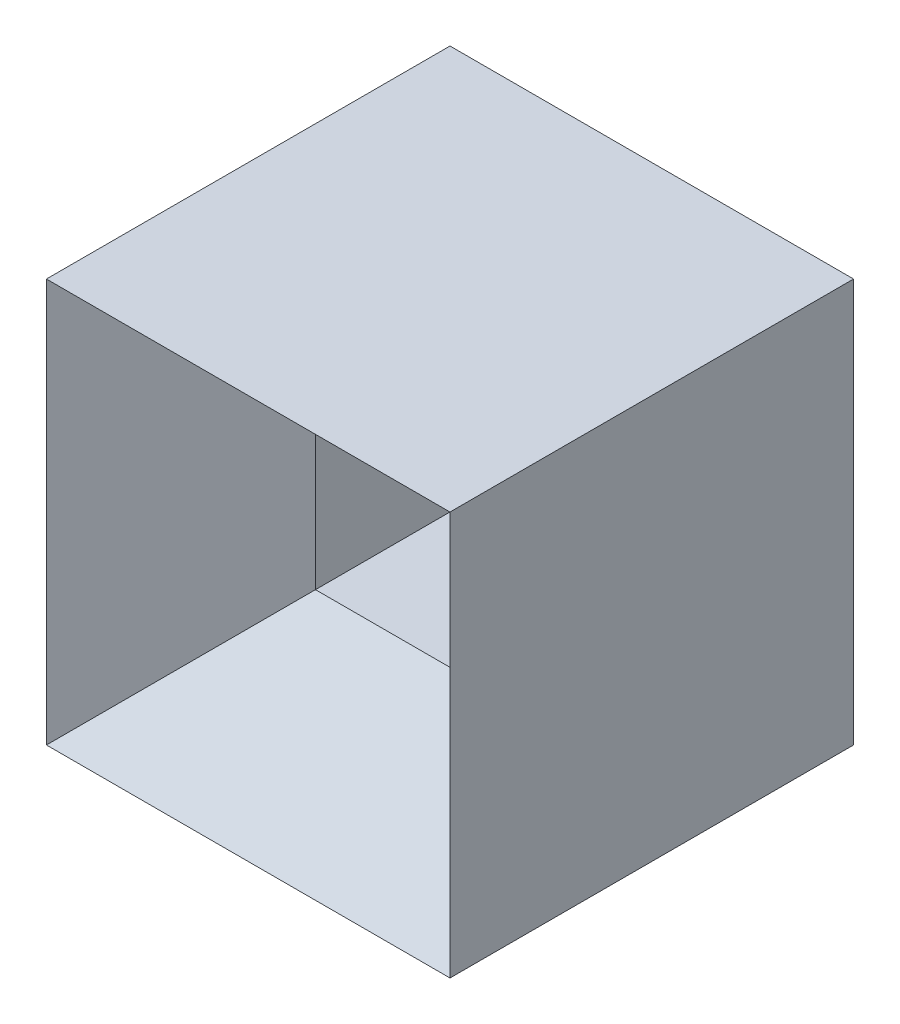
ISO-10303-21;
HEADER;
FILE_DESCRIPTION(('STEP AP214'),'2;1');
FILE_NAME('part.step','',(''),(''),'','','');
FILE_SCHEMA(('AUTOMOTIVE_DESIGN { 1 0 10303 214 1 1 1 1 }'));
ENDSEC;
DATA;
#1=APPLICATION_CONTEXT('core data for automotive mechanical design processes');
#2=APPLICATION_PROTOCOL_DEFINITION('international standard','automotive_design',2000,#1);
#3=PRODUCT_CONTEXT('',#1,'mechanical');
#4=PRODUCT('Part','Part','',(#3));
#5=PRODUCT_RELATED_PRODUCT_CATEGORY('part','',(#4));
#6=PRODUCT_DEFINITION_FORMATION('','',#4);
#7=PRODUCT_DEFINITION_CONTEXT('part definition',#1,'design');
#8=PRODUCT_DEFINITION('design','',#6,#7);
#9=PRODUCT_DEFINITION_SHAPE('','',#8);
#10=(LENGTH_UNIT() NAMED_UNIT(*) SI_UNIT(.MILLI.,.METRE.));
#11=(NAMED_UNIT(*) PLANE_ANGLE_UNIT() SI_UNIT($,.RADIAN.));
#12=(NAMED_UNIT(*) SI_UNIT($,.STERADIAN.) SOLID_ANGLE_UNIT());
#13=UNCERTAINTY_MEASURE_WITH_UNIT(LENGTH_MEASURE(1.E-05),#10,'distance_accuracy_value','');
#14=(GEOMETRIC_REPRESENTATION_CONTEXT(3) GLOBAL_UNCERTAINTY_ASSIGNED_CONTEXT((#13)) GLOBAL_UNIT_ASSIGNED_CONTEXT((#10,
#11,#12)) REPRESENTATION_CONTEXT('',''));
#15=CARTESIAN_POINT('',(0.,0.,0.));
#16=DIRECTION('',(0.,0.,1.));
#17=DIRECTION('',(1.,0.,0.));
#18=AXIS2_PLACEMENT_3D('',#15,#16,#17);
#19=CARTESIAN_POINT('',(0.,0.,0.));
#20=DIRECTION('',(0.,1.,0.));
#21=DIRECTION('',(0.,0.,1.));
#22=AXIS2_PLACEMENT_3D('',#19,#20,#21);
#23=PLANE('',#22);
#24=DIRECTION('',(0.,0.,1.));
#25=VECTOR('',#24,1.);
#26=CARTESIAN_POINT('',(-15.,0.,15.));
#27=LINE('',#26,#25);
#28=CARTESIAN_POINT('',(-14.9999999999998,-1.52655665885959E-13,-15.));
#29=VERTEX_POINT('',#28);
#30=CARTESIAN_POINT('',(-14.9999999999998,-1.59594559789866E-13,15.));
#31=VERTEX_POINT('',#30);
#32=EDGE_CURVE('E514',#29,#31,#27,.T.);
#33=ORIENTED_EDGE('',*,*,#32,.F.);
#34=DIRECTION('',(-1.,0.,0.));
#35=VECTOR('',#34,1.);
#36=CARTESIAN_POINT('',(15.,0.,-15.));
#37=LINE('',#36,#35);
#38=CARTESIAN_POINT('',(15.0000000000001,0.,-15.));
#39=VERTEX_POINT('',#38);
#40=EDGE_CURVE('E191',#39,#29,#37,.T.);
#41=ORIENTED_EDGE('',*,*,#40,.F.);
#42=DIRECTION('',(0.,0.,-1.));
#43=VECTOR('',#42,1.);
#44=CARTESIAN_POINT('',(15.,0.,15.));
#45=LINE('',#44,#43);
#46=CARTESIAN_POINT('',(15.,0.,15.));
#47=VERTEX_POINT('',#46);
#48=EDGE_CURVE('E89',#47,#39,#45,.T.);
#49=ORIENTED_EDGE('',*,*,#48,.F.);
#50=DIRECTION('',(1.,0.,0.));
#51=VECTOR('',#50,1.);
#52=CARTESIAN_POINT('',(15.,0.,15.));
#53=LINE('',#52,#51);
#54=EDGE_CURVE('E12',#31,#47,#53,.T.);
#55=ORIENTED_EDGE('',*,*,#54,.F.);
#56=EDGE_LOOP('',(#33,#41,#49,#55));
#57=FACE_BOUND('',#56,.T.);
#58=ADVANCED_FACE('F79',(#57),#23,.F.);
#59=CARTESIAN_POINT('',(0.,10.,0.));
#60=DIRECTION('',(0.,1.,0.));
#61=DIRECTION('',(0.,0.,1.));
#62=AXIS2_PLACEMENT_3D('',#59,#60,#61);
#63=PLANE('',#62);
#64=DIRECTION('',(0.,0.,1.));
#65=VECTOR('',#64,1.);
#66=CARTESIAN_POINT('',(-5.,10.,5.));
#67=LINE('',#66,#65);
#68=CARTESIAN_POINT('',(-4.99999999999995,9.99999999999995,-5.));
#69=VERTEX_POINT('',#68);
#70=CARTESIAN_POINT('',(-5.,10.,5.));
#71=VERTEX_POINT('',#70);
#72=EDGE_CURVE('E147',#69,#71,#67,.T.);
#73=ORIENTED_EDGE('',*,*,#72,.T.);
#74=DIRECTION('',(1.,0.,0.));
#75=VECTOR('',#74,1.);
#76=CARTESIAN_POINT('',(5.,10.,5.));
#77=LINE('',#76,#75);
#78=CARTESIAN_POINT('',(5.00000000000002,10.,5.));
#79=VERTEX_POINT('',#78);
#80=EDGE_CURVE('E195',#71,#79,#77,.T.);
#81=ORIENTED_EDGE('',*,*,#80,.T.);
#82=DIRECTION('',(0.,0.,-1.));
#83=VECTOR('',#82,1.);
#84=CARTESIAN_POINT('',(5.,10.,5.));
#85=LINE('',#84,#83);
#86=CARTESIAN_POINT('',(5.,10.,-5.));
#87=VERTEX_POINT('',#86);
#88=EDGE_CURVE('E181',#79,#87,#85,.T.);
#89=ORIENTED_EDGE('',*,*,#88,.T.);
#90=DIRECTION('',(-1.,0.,0.));
#91=VECTOR('',#90,1.);
#92=CARTESIAN_POINT('',(5.,10.,-5.));
#93=LINE('',#92,#91);
#94=EDGE_CURVE('E161',#87,#69,#93,.T.);
#95=ORIENTED_EDGE('',*,*,#94,.T.);
#96=EDGE_LOOP('',(#73,#81,#89,#95));
#97=FACE_BOUND('',#96,.T.);
#98=ADVANCED_FACE('F179',(#97),#63,.T.);
#99=CARTESIAN_POINT('',(0.,7.5,7.5));
#100=DIRECTION('',(0.,0.707106781186548,0.707106781186548));
#101=DIRECTION('',(0.,-0.707106781186548,0.707106781186548));
#102=AXIS2_PLACEMENT_3D('',#99,#100,#101);
#103=PLANE('',#102);
#104=DIRECTION('',(-0.577350269189626,-0.577350269189626,0.577350269189626));
#105=VECTOR('',#104,1.);
#106=CARTESIAN_POINT('',(-5.,10.,5.));
#107=LINE('',#106,#105);
#108=EDGE_CURVE('E96',#71,#31,#107,.T.);
#109=ORIENTED_EDGE('',*,*,#108,.T.);
#110=ORIENTED_EDGE('',*,*,#54,.T.);
#111=DIRECTION('',(0.577350269189626,-0.577350269189626,0.577350269189626));
#112=VECTOR('',#111,1.);
#113=CARTESIAN_POINT('',(5.,10.,5.));
#114=LINE('',#113,#112);
#115=EDGE_CURVE('E512',#79,#47,#114,.T.);
#116=ORIENTED_EDGE('',*,*,#115,.F.);
#117=ORIENTED_EDGE('',*,*,#80,.F.);
#118=EDGE_LOOP('',(#109,#110,#116,#117));
#119=FACE_BOUND('',#118,.T.);
#120=ADVANCED_FACE('F220',(#119),#103,.T.);
#121=CARTESIAN_POINT('',(0.,7.5,-7.5));
#122=DIRECTION('',(0.,0.707106781186547,-0.707106781186548));
#123=DIRECTION('',(0.,0.707106781186548,0.707106781186547));
#124=AXIS2_PLACEMENT_3D('',#121,#122,#123);
#125=PLANE('',#124);
#126=DIRECTION('',(0.577350269189626,-0.577350269189626,-0.577350269189626));
#127=VECTOR('',#126,1.);
#128=CARTESIAN_POINT('',(5.,10.,-5.));
#129=LINE('',#128,#127);
#130=EDGE_CURVE('E104',#87,#39,#129,.T.);
#131=ORIENTED_EDGE('',*,*,#130,.T.);
#132=ORIENTED_EDGE('',*,*,#40,.T.);
#133=DIRECTION('',(-0.577350269189626,-0.577350269189626,-0.577350269189626));
#134=VECTOR('',#133,1.);
#135=CARTESIAN_POINT('',(-5.,10.,-5.));
#136=LINE('',#135,#134);
#137=EDGE_CURVE('E168',#69,#29,#136,.T.);
#138=ORIENTED_EDGE('',*,*,#137,.F.);
#139=ORIENTED_EDGE('',*,*,#94,.F.);
#140=EDGE_LOOP('',(#131,#132,#138,#139));
#141=FACE_BOUND('',#140,.T.);
#142=ADVANCED_FACE('F189',(#141),#125,.T.);
#143=CARTESIAN_POINT('',(15.,15.0000000000001,0.));
#144=DIRECTION('',(-1.,0.,0.));
#145=DIRECTION('',(0.,0.,1.));
#146=AXIS2_PLACEMENT_3D('',#143,#144,#145);
#147=PLANE('',#146);
#148=ORIENTED_EDGE('',*,*,#48,.T.);
#149=DIRECTION('',(0.,-1.,0.));
#150=VECTOR('',#149,1.);
#151=CARTESIAN_POINT('',(15.,30.0000000000001,-15.));
#152=LINE('',#151,#150);
#153=CARTESIAN_POINT('',(15.,30.,-15.));
#154=VERTEX_POINT('',#153);
#155=EDGE_CURVE('E385',#154,#39,#152,.T.);
#156=ORIENTED_EDGE('',*,*,#155,.F.);
#157=DIRECTION('',(0.,0.,-1.));
#158=VECTOR('',#157,1.);
#159=CARTESIAN_POINT('',(14.9999999999999,30.,15.));
#160=LINE('',#159,#158);
#161=CARTESIAN_POINT('',(15.,30.,15.));
#162=VERTEX_POINT('',#161);
#163=EDGE_CURVE('E381',#162,#154,#160,.T.);
#164=ORIENTED_EDGE('',*,*,#163,.F.);
#165=DIRECTION('',(0.,1.,0.));
#166=VECTOR('',#165,1.);
#167=CARTESIAN_POINT('',(14.9999999999999,30.,15.));
#168=LINE('',#167,#166);
#169=EDGE_CURVE('E162',#47,#162,#168,.T.);
#170=ORIENTED_EDGE('',*,*,#169,.F.);
#171=EDGE_LOOP('',(#148,#156,#164,#170));
#172=FACE_BOUND('',#171,.T.);
#173=ADVANCED_FACE('F219',(#172),#147,.F.);
#174=CARTESIAN_POINT('',(5.,15.,0.));
#175=DIRECTION('',(-1.,0.,0.));
#176=DIRECTION('',(0.,0.,1.));
#177=AXIS2_PLACEMENT_3D('',#174,#175,#176);
#178=PLANE('',#177);
#179=ORIENTED_EDGE('',*,*,#88,.F.);
#180=DIRECTION('',(0.,1.,0.));
#181=VECTOR('',#180,1.);
#182=CARTESIAN_POINT('',(4.99999999999998,20.,5.));
#183=LINE('',#182,#181);
#184=CARTESIAN_POINT('',(5.,20.,5.));
#185=VERTEX_POINT('',#184);
#186=EDGE_CURVE('E465',#79,#185,#183,.T.);
#187=ORIENTED_EDGE('',*,*,#186,.T.);
#188=DIRECTION('',(0.,0.,-1.));
#189=VECTOR('',#188,1.);
#190=CARTESIAN_POINT('',(4.99999999999998,20.,5.));
#191=LINE('',#190,#189);
#192=CARTESIAN_POINT('',(4.99999999999998,20.,-5.));
#193=VERTEX_POINT('',#192);
#194=EDGE_CURVE('E461',#185,#193,#191,.T.);
#195=ORIENTED_EDGE('',*,*,#194,.T.);
#196=DIRECTION('',(0.,-1.,0.));
#197=VECTOR('',#196,1.);
#198=CARTESIAN_POINT('',(4.99999999999998,20.,-5.));
#199=LINE('',#198,#197);
#200=EDGE_CURVE('E311',#193,#87,#199,.T.);
#201=ORIENTED_EDGE('',*,*,#200,.T.);
#202=EDGE_LOOP('',(#179,#187,#195,#201));
#203=FACE_BOUND('',#202,.T.);
#204=ADVANCED_FACE('F348',(#203),#178,.T.);
#205=CARTESIAN_POINT('',(7.5,15.,7.5));
#206=DIRECTION('',(-0.707106781186548,0.,0.707106781186547));
#207=DIRECTION('',(0.707106781186547,0.,0.707106781186548));
#208=AXIS2_PLACEMENT_3D('',#205,#206,#207);
#209=PLANE('',#208);
#210=ORIENTED_EDGE('',*,*,#115,.T.);
#211=ORIENTED_EDGE('',*,*,#169,.T.);
#212=DIRECTION('',(0.577350269189624,0.577350269189628,0.577350269189626));
#213=VECTOR('',#212,1.);
#214=CARTESIAN_POINT('',(4.99999999999998,20.,5.));
#215=LINE('',#214,#213);
#216=EDGE_CURVE('E391',#185,#162,#215,.T.);
#217=ORIENTED_EDGE('',*,*,#216,.F.);
#218=ORIENTED_EDGE('',*,*,#186,.F.);
#219=EDGE_LOOP('',(#210,#211,#217,#218));
#220=FACE_BOUND('',#219,.T.);
#221=ADVANCED_FACE('F353',(#220),#209,.T.);
#222=CARTESIAN_POINT('',(7.5,15.,-7.5));
#223=DIRECTION('',(-0.707106781186547,0.,-0.707106781186548));
#224=DIRECTION('',(-0.707106781186548,0.,0.707106781186547));
#225=AXIS2_PLACEMENT_3D('',#222,#223,#224);
#226=PLANE('',#225);
#227=DIRECTION('',(0.577350269189624,0.577350269189628,-0.577350269189626));
#228=VECTOR('',#227,1.);
#229=CARTESIAN_POINT('',(4.99999999999998,20.,-5.));
#230=LINE('',#229,#228);
#231=EDGE_CURVE('E470',#193,#154,#230,.T.);
#232=ORIENTED_EDGE('',*,*,#231,.T.);
#233=ORIENTED_EDGE('',*,*,#155,.T.);
#234=ORIENTED_EDGE('',*,*,#130,.F.);
#235=ORIENTED_EDGE('',*,*,#200,.F.);
#236=EDGE_LOOP('',(#232,#233,#234,#235));
#237=FACE_BOUND('',#236,.T.);
#238=ADVANCED_FACE('F346',(#237),#226,.T.);
#239=CARTESIAN_POINT('',(0.,30.,0.));
#240=DIRECTION('',(0.,-1.,0.));
#241=DIRECTION('',(0.,0.,1.));
#242=AXIS2_PLACEMENT_3D('',#239,#240,#241);
#243=PLANE('',#242);
#244=ORIENTED_EDGE('',*,*,#163,.T.);
#245=DIRECTION('',(1.,0.,0.));
#246=VECTOR('',#245,1.);
#247=CARTESIAN_POINT('',(-15.,30.,-15.));
#248=LINE('',#247,#246);
#249=CARTESIAN_POINT('',(-15.0000000000002,29.9999999999998,-15.));
#250=VERTEX_POINT('',#249);
#251=EDGE_CURVE('E317',#250,#154,#248,.T.);
#252=ORIENTED_EDGE('',*,*,#251,.F.);
#253=DIRECTION('',(0.,0.,-1.));
#254=VECTOR('',#253,1.);
#255=CARTESIAN_POINT('',(-15.,30.,15.));
#256=LINE('',#255,#254);
#257=CARTESIAN_POINT('',(-15.0000000000002,29.9999999999998,15.));
#258=VERTEX_POINT('',#257);
#259=EDGE_CURVE('E312',#258,#250,#256,.T.);
#260=ORIENTED_EDGE('',*,*,#259,.F.);
#261=DIRECTION('',(-1.,0.,0.));
#262=VECTOR('',#261,1.);
#263=CARTESIAN_POINT('',(-15.,30.,15.));
#264=LINE('',#263,#262);
#265=EDGE_CURVE('E306',#162,#258,#264,.T.);
#266=ORIENTED_EDGE('',*,*,#265,.F.);
#267=EDGE_LOOP('',(#244,#252,#260,#266));
#268=FACE_BOUND('',#267,.T.);
#269=ADVANCED_FACE('F281',(#268),#243,.F.);
#270=CARTESIAN_POINT('',(0.,20.,0.));
#271=DIRECTION('',(0.,-1.,0.));
#272=DIRECTION('',(0.,0.,1.));
#273=AXIS2_PLACEMENT_3D('',#270,#271,#272);
#274=PLANE('',#273);
#275=ORIENTED_EDGE('',*,*,#194,.F.);
#276=DIRECTION('',(-1.,0.,0.));
#277=VECTOR('',#276,1.);
#278=CARTESIAN_POINT('',(-5.,20.,5.));
#279=LINE('',#278,#277);
#280=CARTESIAN_POINT('',(-5.00000000000005,19.9999999999999,5.));
#281=VERTEX_POINT('',#280);
#282=EDGE_CURVE('E568',#185,#281,#279,.T.);
#283=ORIENTED_EDGE('',*,*,#282,.T.);
#284=DIRECTION('',(0.,0.,-1.));
#285=VECTOR('',#284,1.);
#286=CARTESIAN_POINT('',(-5.,20.,5.));
#287=LINE('',#286,#285);
#288=CARTESIAN_POINT('',(-5.,20.,-5.));
#289=VERTEX_POINT('',#288);
#290=EDGE_CURVE('E392',#281,#289,#287,.T.);
#291=ORIENTED_EDGE('',*,*,#290,.T.);
#292=DIRECTION('',(1.,0.,0.));
#293=VECTOR('',#292,1.);
#294=CARTESIAN_POINT('',(-5.,20.,-5.));
#295=LINE('',#294,#293);
#296=EDGE_CURVE('E313',#289,#193,#295,.T.);
#297=ORIENTED_EDGE('',*,*,#296,.T.);
#298=EDGE_LOOP('',(#275,#283,#291,#297));
#299=FACE_BOUND('',#298,.T.);
#300=ADVANCED_FACE('F275',(#299),#274,.T.);
#301=CARTESIAN_POINT('',(0.,22.5,7.50000000000001));
#302=DIRECTION('',(0.,-0.707106781186548,0.707106781186547));
#303=DIRECTION('',(0.,0.707106781186547,0.707106781186548));
#304=AXIS2_PLACEMENT_3D('',#301,#302,#303);
#305=PLANE('',#304);
#306=ORIENTED_EDGE('',*,*,#216,.T.);
#307=ORIENTED_EDGE('',*,*,#265,.T.);
#308=DIRECTION('',(-0.577350269189626,0.577350269189626,0.577350269189626));
#309=VECTOR('',#308,1.);
#310=CARTESIAN_POINT('',(-5.,20.,5.));
#311=LINE('',#310,#309);
#312=EDGE_CURVE('E322',#281,#258,#311,.T.);
#313=ORIENTED_EDGE('',*,*,#312,.F.);
#314=ORIENTED_EDGE('',*,*,#282,.F.);
#315=EDGE_LOOP('',(#306,#307,#313,#314));
#316=FACE_BOUND('',#315,.T.);
#317=ADVANCED_FACE('F280',(#316),#305,.T.);
#318=CARTESIAN_POINT('',(0.,22.5,-7.5));
#319=DIRECTION('',(0.,-0.707106781186547,-0.707106781186548));
#320=DIRECTION('',(0.,-0.707106781186548,0.707106781186547));
#321=AXIS2_PLACEMENT_3D('',#318,#319,#320);
#322=PLANE('',#321);
#323=DIRECTION('',(-0.577350269189626,0.577350269189626,-0.577350269189626));
#324=VECTOR('',#323,1.);
#325=CARTESIAN_POINT('',(-5.,20.,-5.));
#326=LINE('',#325,#324);
#327=EDGE_CURVE('E171',#289,#250,#326,.T.);
#328=ORIENTED_EDGE('',*,*,#327,.T.);
#329=ORIENTED_EDGE('',*,*,#251,.T.);
#330=ORIENTED_EDGE('',*,*,#231,.F.);
#331=ORIENTED_EDGE('',*,*,#296,.F.);
#332=EDGE_LOOP('',(#328,#329,#330,#331));
#333=FACE_BOUND('',#332,.T.);
#334=ADVANCED_FACE('F272',(#333),#322,.T.);
#335=CARTESIAN_POINT('',(-15.,14.9999999999998,0.));
#336=DIRECTION('',(1.,0.,0.));
#337=DIRECTION('',(0.,0.,1.));
#338=AXIS2_PLACEMENT_3D('',#335,#336,#337);
#339=PLANE('',#338);
#340=ORIENTED_EDGE('',*,*,#259,.T.);
#341=DIRECTION('',(0.,1.,0.));
#342=VECTOR('',#341,1.);
#343=CARTESIAN_POINT('',(-14.9999999999998,-1.52655665885959E-13,-15.));
#344=LINE('',#343,#342);
#345=EDGE_CURVE('E240',#29,#250,#344,.T.);
#346=ORIENTED_EDGE('',*,*,#345,.F.);
#347=ORIENTED_EDGE('',*,*,#32,.T.);
#348=DIRECTION('',(0.,-1.,0.));
#349=VECTOR('',#348,1.);
#350=CARTESIAN_POINT('',(-14.9999999999998,-1.59594559789866E-13,15.));
#351=LINE('',#350,#349);
#352=EDGE_CURVE('E244',#258,#31,#351,.T.);
#353=ORIENTED_EDGE('',*,*,#352,.F.);
#354=EDGE_LOOP('',(#340,#346,#347,#353));
#355=FACE_BOUND('',#354,.T.);
#356=ADVANCED_FACE('F262',(#355),#339,.F.);
#357=CARTESIAN_POINT('',(-5.,14.9999999999999,0.));
#358=DIRECTION('',(1.,0.,0.));
#359=DIRECTION('',(0.,0.,1.));
#360=AXIS2_PLACEMENT_3D('',#357,#358,#359);
#361=PLANE('',#360);
#362=ORIENTED_EDGE('',*,*,#290,.F.);
#363=DIRECTION('',(0.,-1.,0.));
#364=VECTOR('',#363,1.);
#365=CARTESIAN_POINT('',(-4.99999999999995,9.99999999999994,5.));
#366=LINE('',#365,#364);
#367=EDGE_CURVE('E154',#281,#71,#366,.T.);
#368=ORIENTED_EDGE('',*,*,#367,.T.);
#369=ORIENTED_EDGE('',*,*,#72,.F.);
#370=DIRECTION('',(0.,1.,0.));
#371=VECTOR('',#370,1.);
#372=CARTESIAN_POINT('',(-4.99999999999995,9.99999999999995,-5.));
#373=LINE('',#372,#371);
#374=EDGE_CURVE('E151',#69,#289,#373,.T.);
#375=ORIENTED_EDGE('',*,*,#374,.T.);
#376=EDGE_LOOP('',(#362,#368,#369,#375));
#377=FACE_BOUND('',#376,.T.);
#378=ADVANCED_FACE('F150',(#377),#361,.T.);
#379=CARTESIAN_POINT('',(-7.5,14.9999999999999,7.5));
#380=DIRECTION('',(0.707106781186548,0.,0.707106781186547));
#381=DIRECTION('',(-0.707106781186547,0.,0.707106781186548));
#382=AXIS2_PLACEMENT_3D('',#379,#380,#381);
#383=PLANE('',#382);
#384=ORIENTED_EDGE('',*,*,#312,.T.);
#385=ORIENTED_EDGE('',*,*,#352,.T.);
#386=ORIENTED_EDGE('',*,*,#108,.F.);
#387=ORIENTED_EDGE('',*,*,#367,.F.);
#388=EDGE_LOOP('',(#384,#385,#386,#387));
#389=FACE_BOUND('',#388,.T.);
#390=ADVANCED_FACE('F539',(#389),#383,.T.);
#391=CARTESIAN_POINT('',(-7.5,14.9999999999999,-7.5));
#392=DIRECTION('',(0.707106781186547,0.,-0.707106781186548));
#393=DIRECTION('',(0.707106781186548,0.,0.707106781186547));
#394=AXIS2_PLACEMENT_3D('',#391,#392,#393);
#395=PLANE('',#394);
#396=ORIENTED_EDGE('',*,*,#137,.T.);
#397=ORIENTED_EDGE('',*,*,#345,.T.);
#398=ORIENTED_EDGE('',*,*,#327,.F.);
#399=ORIENTED_EDGE('',*,*,#374,.F.);
#400=EDGE_LOOP('',(#396,#397,#398,#399));
#401=FACE_BOUND('',#400,.T.);
#402=ADVANCED_FACE('F166',(#401),#395,.T.);
#403=CLOSED_SHELL('',(#58,#98,#120,#142,#173,#204,#221,#238,#269,#300,#317,#334,#356,#378,#390,#402));
#404=MANIFOLD_SOLID_BREP('B2',#403);
#405=ADVANCED_BREP_SHAPE_REPRESENTATION('',(#18,#404),#14);
#406=SHAPE_DEFINITION_REPRESENTATION(#9,#405);
ENDSEC;
END-ISO-10303-21;
